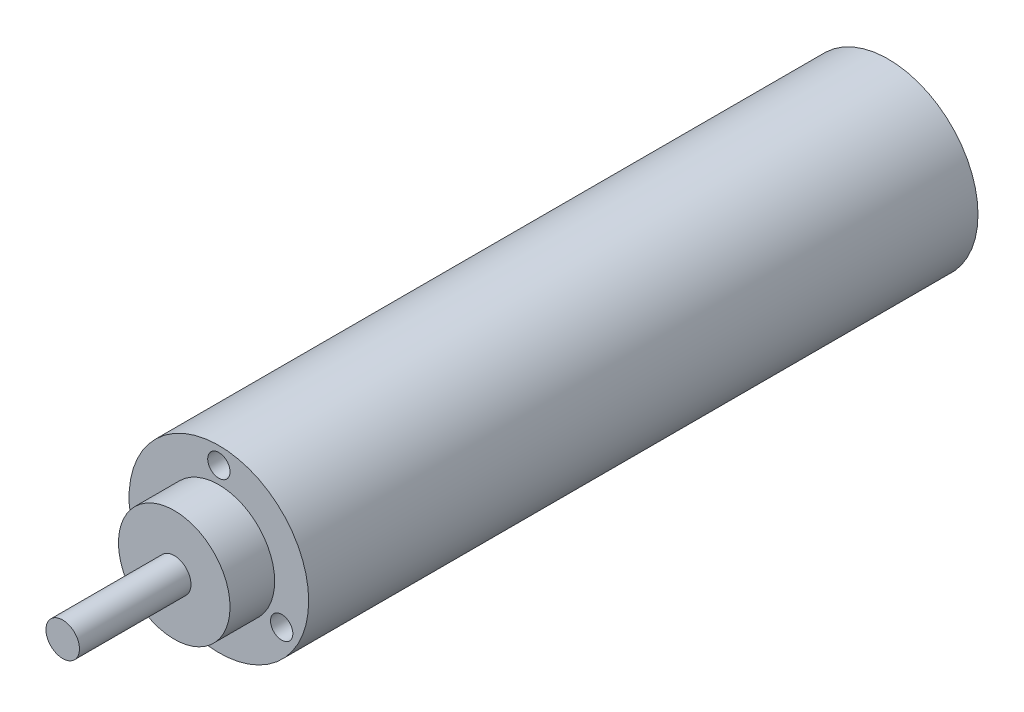
ISO-10303-21;
HEADER;
FILE_DESCRIPTION(('STEP AP214'),'2;1');
FILE_NAME('part.step','',(''),(''),'','','');
FILE_SCHEMA(('AUTOMOTIVE_DESIGN { 1 0 10303 214 1 1 1 1 }'));
ENDSEC;
DATA;
#1=APPLICATION_CONTEXT('core data for automotive mechanical design processes');
#2=APPLICATION_PROTOCOL_DEFINITION('international standard','automotive_design',2000,#1);
#3=PRODUCT_CONTEXT('',#1,'mechanical');
#4=PRODUCT('Part','Part','',(#3));
#5=PRODUCT_RELATED_PRODUCT_CATEGORY('part','',(#4));
#6=PRODUCT_DEFINITION_FORMATION('','',#4);
#7=PRODUCT_DEFINITION_CONTEXT('part definition',#1,'design');
#8=PRODUCT_DEFINITION('design','',#6,#7);
#9=PRODUCT_DEFINITION_SHAPE('','',#8);
#10=(LENGTH_UNIT() NAMED_UNIT(*) SI_UNIT(.MILLI.,.METRE.));
#11=(NAMED_UNIT(*) PLANE_ANGLE_UNIT() SI_UNIT($,.RADIAN.));
#12=(NAMED_UNIT(*) SI_UNIT($,.STERADIAN.) SOLID_ANGLE_UNIT());
#13=UNCERTAINTY_MEASURE_WITH_UNIT(LENGTH_MEASURE(1.E-05),#10,'distance_accuracy_value','');
#14=(GEOMETRIC_REPRESENTATION_CONTEXT(3) GLOBAL_UNCERTAINTY_ASSIGNED_CONTEXT((#13)) GLOBAL_UNIT_ASSIGNED_CONTEXT((#10,
#11,#12)) REPRESENTATION_CONTEXT('',''));
#15=CARTESIAN_POINT('',(0.,0.,0.));
#16=DIRECTION('',(0.,0.,1.));
#17=DIRECTION('',(1.,0.,0.));
#18=AXIS2_PLACEMENT_3D('',#15,#16,#17);
#19=CARTESIAN_POINT('',(0.,0.,60.));
#20=DIRECTION('',(0.,0.,-1.));
#21=DIRECTION('',(-1.,0.,0.));
#22=AXIS2_PLACEMENT_3D('',#19,#20,#21);
#23=CYLINDRICAL_SURFACE('',#22,8.05);
#24=CARTESIAN_POINT('',(0.,0.,60.));
#25=DIRECTION('',(0.,0.,1.));
#26=DIRECTION('',(1.,0.,0.));
#27=AXIS2_PLACEMENT_3D('',#24,#25,#26);
#28=CIRCLE('',#27,8.05);
#29=CARTESIAN_POINT('',(8.05,0.,60.));
#30=VERTEX_POINT('',#29);
#31=EDGE_CURVE('E52',#30,#30,#28,.T.);
#32=ORIENTED_EDGE('',*,*,#31,.F.);
#33=EDGE_LOOP('',(#32));
#34=FACE_BOUND('',#33,.T.);
#35=CARTESIAN_POINT('',(0.,0.,0.));
#36=DIRECTION('',(0.,0.,1.));
#37=DIRECTION('',(1.,0.,0.));
#38=AXIS2_PLACEMENT_3D('',#35,#36,#37);
#39=CIRCLE('',#38,8.05);
#40=CARTESIAN_POINT('',(8.05,0.,0.));
#41=VERTEX_POINT('',#40);
#42=EDGE_CURVE('E39',#41,#41,#39,.T.);
#43=ORIENTED_EDGE('',*,*,#42,.T.);
#44=EDGE_LOOP('',(#43));
#45=FACE_BOUND('',#44,.T.);
#46=ADVANCED_FACE('F36',(#34,#45),#23,.T.);
#47=CARTESIAN_POINT('',(0.,0.,60.));
#48=DIRECTION('',(0.,0.,1.));
#49=DIRECTION('',(1.,0.,0.));
#50=AXIS2_PLACEMENT_3D('',#47,#48,#49);
#51=PLANE('',#50);
#52=CARTESIAN_POINT('',(0.,6.5,60.));
#53=DIRECTION('',(0.,0.,1.));
#54=DIRECTION('',(1.,0.,0.));
#55=AXIS2_PLACEMENT_3D('',#52,#53,#54);
#56=CIRCLE('',#55,1.);
#57=CARTESIAN_POINT('',(1.,6.5,60.));
#58=VERTEX_POINT('',#57);
#59=EDGE_CURVE('E61',#58,#58,#56,.T.);
#60=ORIENTED_EDGE('',*,*,#59,.F.);
#61=EDGE_LOOP('',(#60));
#62=FACE_BOUND('',#61,.T.);
#63=CARTESIAN_POINT('',(5.62916512459884,-3.25000000000003,60.));
#64=DIRECTION('',(0.,0.,1.));
#65=DIRECTION('',(1.,0.,0.));
#66=AXIS2_PLACEMENT_3D('',#63,#64,#65);
#67=CIRCLE('',#66,1.);
#68=CARTESIAN_POINT('',(6.62916512459884,-3.25000000000003,60.));
#69=VERTEX_POINT('',#68);
#70=EDGE_CURVE('E69',#69,#69,#67,.T.);
#71=ORIENTED_EDGE('',*,*,#70,.F.);
#72=EDGE_LOOP('',(#71));
#73=FACE_BOUND('',#72,.T.);
#74=CARTESIAN_POINT('',(-5.62916512459883,-3.25000000000003,60.));
#75=DIRECTION('',(0.,0.,1.));
#76=DIRECTION('',(1.,0.,0.));
#77=AXIS2_PLACEMENT_3D('',#74,#75,#76);
#78=CIRCLE('',#77,1.);
#79=CARTESIAN_POINT('',(-4.62916512459883,-3.25000000000003,60.));
#80=VERTEX_POINT('',#79);
#81=EDGE_CURVE('E77',#80,#80,#78,.T.);
#82=ORIENTED_EDGE('',*,*,#81,.F.);
#83=EDGE_LOOP('',(#82));
#84=FACE_BOUND('',#83,.T.);
#85=CARTESIAN_POINT('',(0.,0.,60.));
#86=DIRECTION('',(0.,0.,1.));
#87=DIRECTION('',(1.,0.,0.));
#88=AXIS2_PLACEMENT_3D('',#85,#86,#87);
#89=CIRCLE('',#88,5.);
#90=CARTESIAN_POINT('',(5.,0.,60.));
#91=VERTEX_POINT('',#90);
#92=EDGE_CURVE('E44',#91,#91,#89,.T.);
#93=ORIENTED_EDGE('',*,*,#92,.F.);
#94=EDGE_LOOP('',(#93));
#95=FACE_BOUND('',#94,.T.);
#96=ORIENTED_EDGE('',*,*,#31,.T.);
#97=EDGE_LOOP('',(#96));
#98=FACE_BOUND('',#97,.T.);
#99=ADVANCED_FACE('F95',(#62,#73,#84,#95,#98),#51,.T.);
#100=CARTESIAN_POINT('',(0.,0.,0.));
#101=DIRECTION('',(0.,0.,1.));
#102=DIRECTION('',(1.,0.,0.));
#103=AXIS2_PLACEMENT_3D('',#100,#101,#102);
#104=PLANE('',#103);
#105=ORIENTED_EDGE('',*,*,#42,.F.);
#106=EDGE_LOOP('',(#105));
#107=FACE_BOUND('',#106,.T.);
#108=ADVANCED_FACE('F92',(#107),#104,.F.);
#109=CARTESIAN_POINT('',(0.,0.,64.));
#110=DIRECTION('',(0.,0.,-1.));
#111=DIRECTION('',(-1.,0.,0.));
#112=AXIS2_PLACEMENT_3D('',#109,#110,#111);
#113=CYLINDRICAL_SURFACE('',#112,5.);
#114=CARTESIAN_POINT('',(0.,0.,64.));
#115=DIRECTION('',(0.,0.,1.));
#116=DIRECTION('',(1.,0.,0.));
#117=AXIS2_PLACEMENT_3D('',#114,#115,#116);
#118=CIRCLE('',#117,5.);
#119=CARTESIAN_POINT('',(5.,0.,64.));
#120=VERTEX_POINT('',#119);
#121=EDGE_CURVE('E60',#120,#120,#118,.T.);
#122=ORIENTED_EDGE('',*,*,#121,.F.);
#123=EDGE_LOOP('',(#122));
#124=FACE_BOUND('',#123,.T.);
#125=ORIENTED_EDGE('',*,*,#92,.T.);
#126=EDGE_LOOP('',(#125));
#127=FACE_BOUND('',#126,.T.);
#128=ADVANCED_FACE('F94',(#124,#127),#113,.T.);
#129=CARTESIAN_POINT('',(0.,0.,64.));
#130=DIRECTION('',(0.,0.,1.));
#131=DIRECTION('',(1.,0.,0.));
#132=AXIS2_PLACEMENT_3D('',#129,#130,#131);
#133=PLANE('',#132);
#134=CARTESIAN_POINT('',(0.,0.,64.));
#135=DIRECTION('',(0.,0.,1.));
#136=DIRECTION('',(1.,0.,0.));
#137=AXIS2_PLACEMENT_3D('',#134,#135,#136);
#138=CIRCLE('',#137,1.5);
#139=CARTESIAN_POINT('',(1.5,0.,64.));
#140=VERTEX_POINT('',#139);
#141=EDGE_CURVE('E10',#140,#140,#138,.T.);
#142=ORIENTED_EDGE('',*,*,#141,.F.);
#143=EDGE_LOOP('',(#142));
#144=FACE_BOUND('',#143,.T.);
#145=ORIENTED_EDGE('',*,*,#121,.T.);
#146=EDGE_LOOP('',(#145));
#147=FACE_BOUND('',#146,.T.);
#148=ADVANCED_FACE('F100',(#144,#147),#133,.T.);
#149=CARTESIAN_POINT('',(-5.62916512459883,-3.25000000000003,55.));
#150=DIRECTION('',(0.,0.,1.));
#151=DIRECTION('',(1.,0.,0.));
#152=AXIS2_PLACEMENT_3D('',#149,#150,#151);
#153=CYLINDRICAL_SURFACE('',#152,1.);
#154=CARTESIAN_POINT('',(-5.62916512459883,-3.25000000000003,55.));
#155=DIRECTION('',(0.,0.,1.));
#156=DIRECTION('',(1.,0.,0.));
#157=AXIS2_PLACEMENT_3D('',#154,#155,#156);
#158=CIRCLE('',#157,1.);
#159=CARTESIAN_POINT('',(-4.62916512459883,-3.25000000000003,55.));
#160=VERTEX_POINT('',#159);
#161=EDGE_CURVE('E73',#160,#160,#158,.T.);
#162=ORIENTED_EDGE('',*,*,#161,.F.);
#163=EDGE_LOOP('',(#162));
#164=FACE_BOUND('',#163,.T.);
#165=ORIENTED_EDGE('',*,*,#81,.T.);
#166=EDGE_LOOP('',(#165));
#167=FACE_BOUND('',#166,.T.);
#168=ADVANCED_FACE('F128',(#164,#167),#153,.F.);
#169=CARTESIAN_POINT('',(-5.62916512459883,-3.25000000000003,55.));
#170=DIRECTION('',(0.,0.,1.));
#171=DIRECTION('',(1.,0.,0.));
#172=AXIS2_PLACEMENT_3D('',#169,#170,#171);
#173=PLANE('',#172);
#174=ORIENTED_EDGE('',*,*,#161,.T.);
#175=EDGE_LOOP('',(#174));
#176=FACE_BOUND('',#175,.T.);
#177=ADVANCED_FACE('F138',(#176),#173,.T.);
#178=CARTESIAN_POINT('',(5.62916512459884,-3.25000000000003,55.));
#179=DIRECTION('',(0.,0.,1.));
#180=DIRECTION('',(1.,0.,0.));
#181=AXIS2_PLACEMENT_3D('',#178,#179,#180);
#182=CYLINDRICAL_SURFACE('',#181,1.);
#183=CARTESIAN_POINT('',(5.62916512459884,-3.25000000000003,55.));
#184=DIRECTION('',(0.,0.,1.));
#185=DIRECTION('',(1.,0.,0.));
#186=AXIS2_PLACEMENT_3D('',#183,#184,#185);
#187=CIRCLE('',#186,1.);
#188=CARTESIAN_POINT('',(6.62916512459884,-3.25000000000003,55.));
#189=VERTEX_POINT('',#188);
#190=EDGE_CURVE('E65',#189,#189,#187,.T.);
#191=ORIENTED_EDGE('',*,*,#190,.F.);
#192=EDGE_LOOP('',(#191));
#193=FACE_BOUND('',#192,.T.);
#194=ORIENTED_EDGE('',*,*,#70,.T.);
#195=EDGE_LOOP('',(#194));
#196=FACE_BOUND('',#195,.T.);
#197=ADVANCED_FACE('F147',(#193,#196),#182,.F.);
#198=CARTESIAN_POINT('',(5.62916512459884,-3.25000000000003,55.));
#199=DIRECTION('',(0.,0.,1.));
#200=DIRECTION('',(1.,0.,0.));
#201=AXIS2_PLACEMENT_3D('',#198,#199,#200);
#202=PLANE('',#201);
#203=ORIENTED_EDGE('',*,*,#190,.T.);
#204=EDGE_LOOP('',(#203));
#205=FACE_BOUND('',#204,.T.);
#206=ADVANCED_FACE('F156',(#205),#202,.T.);
#207=CARTESIAN_POINT('',(0.,6.5,55.));
#208=DIRECTION('',(0.,0.,1.));
#209=DIRECTION('',(1.,0.,0.));
#210=AXIS2_PLACEMENT_3D('',#207,#208,#209);
#211=CYLINDRICAL_SURFACE('',#210,1.);
#212=CARTESIAN_POINT('',(0.,6.5,55.));
#213=DIRECTION('',(0.,0.,1.));
#214=DIRECTION('',(1.,0.,0.));
#215=AXIS2_PLACEMENT_3D('',#212,#213,#214);
#216=CIRCLE('',#215,1.);
#217=CARTESIAN_POINT('',(1.,6.5,55.));
#218=VERTEX_POINT('',#217);
#219=EDGE_CURVE('E57',#218,#218,#216,.T.);
#220=ORIENTED_EDGE('',*,*,#219,.F.);
#221=EDGE_LOOP('',(#220));
#222=FACE_BOUND('',#221,.T.);
#223=ORIENTED_EDGE('',*,*,#59,.T.);
#224=EDGE_LOOP('',(#223));
#225=FACE_BOUND('',#224,.T.);
#226=ADVANCED_FACE('F165',(#222,#225),#211,.F.);
#227=CARTESIAN_POINT('',(0.,6.5,55.));
#228=DIRECTION('',(0.,0.,1.));
#229=DIRECTION('',(1.,0.,0.));
#230=AXIS2_PLACEMENT_3D('',#227,#228,#229);
#231=PLANE('',#230);
#232=ORIENTED_EDGE('',*,*,#219,.T.);
#233=EDGE_LOOP('',(#232));
#234=FACE_BOUND('',#233,.T.);
#235=ADVANCED_FACE('F174',(#234),#231,.T.);
#236=CARTESIAN_POINT('',(0.,0.,74.));
#237=DIRECTION('',(0.,0.,-1.));
#238=DIRECTION('',(-1.,0.,0.));
#239=AXIS2_PLACEMENT_3D('',#236,#237,#238);
#240=CYLINDRICAL_SURFACE('',#239,1.5);
#241=CARTESIAN_POINT('',(0.,0.,74.));
#242=DIRECTION('',(0.,0.,1.));
#243=DIRECTION('',(1.,0.,0.));
#244=AXIS2_PLACEMENT_3D('',#241,#242,#243);
#245=CIRCLE('',#244,1.5);
#246=CARTESIAN_POINT('',(1.5,0.,74.));
#247=VERTEX_POINT('',#246);
#248=EDGE_CURVE('E56',#247,#247,#245,.T.);
#249=ORIENTED_EDGE('',*,*,#248,.F.);
#250=EDGE_LOOP('',(#249));
#251=FACE_BOUND('',#250,.T.);
#252=ORIENTED_EDGE('',*,*,#141,.T.);
#253=EDGE_LOOP('',(#252));
#254=FACE_BOUND('',#253,.T.);
#255=ADVANCED_FACE('F182',(#251,#254),#240,.T.);
#256=CARTESIAN_POINT('',(0.,0.,74.));
#257=DIRECTION('',(0.,0.,1.));
#258=DIRECTION('',(1.,0.,0.));
#259=AXIS2_PLACEMENT_3D('',#256,#257,#258);
#260=PLANE('',#259);
#261=ORIENTED_EDGE('',*,*,#248,.T.);
#262=EDGE_LOOP('',(#261));
#263=FACE_BOUND('',#262,.T.);
#264=ADVANCED_FACE('F190',(#263),#260,.T.);
#265=CLOSED_SHELL('',(#46,#99,#108,#128,#148,#168,#177,#197,#206,#226,#235,#255,#264));
#266=MANIFOLD_SOLID_BREP('B2',#265);
#267=ADVANCED_BREP_SHAPE_REPRESENTATION('',(#18,#266),#14);
#268=SHAPE_DEFINITION_REPRESENTATION(#9,#267);
ENDSEC;
END-ISO-10303-21;
